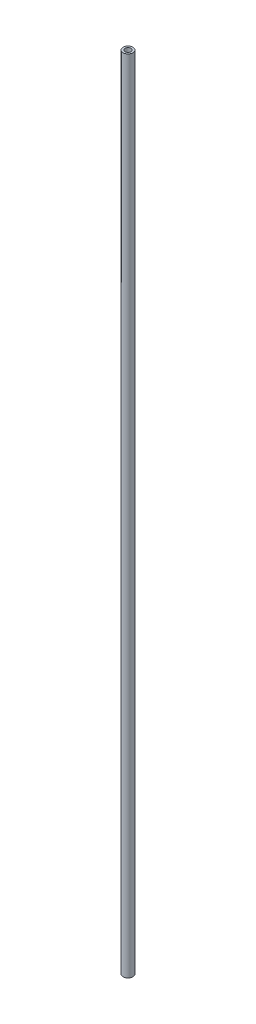
ISO-10303-21;
HEADER;
FILE_DESCRIPTION(('STEP AP214'),'2;1');
FILE_NAME('part.step','',(''),(''),'','','');
FILE_SCHEMA(('AUTOMOTIVE_DESIGN { 1 0 10303 214 1 1 1 1 }'));
ENDSEC;
DATA;
#1=APPLICATION_CONTEXT('core data for automotive mechanical design processes');
#2=APPLICATION_PROTOCOL_DEFINITION('international standard','automotive_design',2000,#1);
#3=PRODUCT_CONTEXT('',#1,'mechanical');
#4=PRODUCT('Part','Part','',(#3));
#5=PRODUCT_RELATED_PRODUCT_CATEGORY('part','',(#4));
#6=PRODUCT_DEFINITION_FORMATION('','',#4);
#7=PRODUCT_DEFINITION_CONTEXT('part definition',#1,'design');
#8=PRODUCT_DEFINITION('design','',#6,#7);
#9=PRODUCT_DEFINITION_SHAPE('','',#8);
#10=(LENGTH_UNIT() NAMED_UNIT(*) SI_UNIT(.MILLI.,.METRE.));
#11=(NAMED_UNIT(*) PLANE_ANGLE_UNIT() SI_UNIT($,.RADIAN.));
#12=(NAMED_UNIT(*) SI_UNIT($,.STERADIAN.) SOLID_ANGLE_UNIT());
#13=UNCERTAINTY_MEASURE_WITH_UNIT(LENGTH_MEASURE(1.E-05),#10,'distance_accuracy_value','');
#14=(GEOMETRIC_REPRESENTATION_CONTEXT(3) GLOBAL_UNCERTAINTY_ASSIGNED_CONTEXT((#13)) GLOBAL_UNIT_ASSIGNED_CONTEXT((#10,
#11,#12)) REPRESENTATION_CONTEXT('',''));
#15=CARTESIAN_POINT('',(0.,0.,0.));
#16=DIRECTION('',(0.,0.,1.));
#17=DIRECTION('',(1.,0.,0.));
#18=AXIS2_PLACEMENT_3D('',#15,#16,#17);
#19=CARTESIAN_POINT('',(0.,205.,0.));
#20=DIRECTION('',(0.,1.,0.));
#21=DIRECTION('',(0.,0.,1.));
#22=AXIS2_PLACEMENT_3D('',#19,#20,#21);
#23=PLANE('',#22);
#24=CARTESIAN_POINT('',(0.,205.,0.));
#25=DIRECTION('',(0.,1.,0.));
#26=DIRECTION('',(0.,0.,1.));
#27=AXIS2_PLACEMENT_3D('',#24,#25,#26);
#28=CIRCLE('',#27,2.5);
#29=CARTESIAN_POINT('',(0.,205.,-2.5));
#30=VERTEX_POINT('',#29);
#31=EDGE_CURVE('E12',#30,#30,#28,.T.);
#32=ORIENTED_EDGE('',*,*,#31,.T.);
#33=EDGE_LOOP('',(#32));
#34=FACE_BOUND('',#33,.T.);
#35=CARTESIAN_POINT('',(0.,205.,0.));
#36=DIRECTION('',(0.,1.,0.));
#37=DIRECTION('',(0.,0.,1.));
#38=AXIS2_PLACEMENT_3D('',#35,#36,#37);
#39=CIRCLE('',#38,1.5);
#40=CARTESIAN_POINT('',(0.,205.,-1.5));
#41=VERTEX_POINT('',#40);
#42=EDGE_CURVE('E54',#41,#41,#39,.T.);
#43=ORIENTED_EDGE('',*,*,#42,.F.);
#44=EDGE_LOOP('',(#43));
#45=FACE_BOUND('',#44,.T.);
#46=ADVANCED_FACE('F43',(#34,#45),#23,.T.);
#47=CARTESIAN_POINT('',(0.,-205.,0.));
#48=DIRECTION('',(0.,1.,0.));
#49=DIRECTION('',(0.,0.,1.));
#50=AXIS2_PLACEMENT_3D('',#47,#48,#49);
#51=PLANE('',#50);
#52=CARTESIAN_POINT('',(0.,-205.,0.));
#53=DIRECTION('',(0.,1.,0.));
#54=DIRECTION('',(0.,0.,1.));
#55=AXIS2_PLACEMENT_3D('',#52,#53,#54);
#56=CIRCLE('',#55,2.5);
#57=CARTESIAN_POINT('',(0.,-205.,-2.5));
#58=VERTEX_POINT('',#57);
#59=EDGE_CURVE('E47',#58,#58,#56,.T.);
#60=ORIENTED_EDGE('',*,*,#59,.F.);
#61=EDGE_LOOP('',(#60));
#62=FACE_BOUND('',#61,.T.);
#63=CARTESIAN_POINT('',(0.,-205.,0.));
#64=DIRECTION('',(0.,1.,0.));
#65=DIRECTION('',(0.,0.,1.));
#66=AXIS2_PLACEMENT_3D('',#63,#64,#65);
#67=CIRCLE('',#66,1.5);
#68=CARTESIAN_POINT('',(0.,-205.,-1.5));
#69=VERTEX_POINT('',#68);
#70=EDGE_CURVE('E56',#69,#69,#67,.T.);
#71=ORIENTED_EDGE('',*,*,#70,.T.);
#72=EDGE_LOOP('',(#71));
#73=FACE_BOUND('',#72,.T.);
#74=ADVANCED_FACE('F66',(#62,#73),#51,.F.);
#75=CARTESIAN_POINT('',(0.,205.,0.));
#76=DIRECTION('',(0.,-1.,0.));
#77=DIRECTION('',(0.,0.,-1.));
#78=AXIS2_PLACEMENT_3D('',#75,#76,#77);
#79=CYLINDRICAL_SURFACE('',#78,2.5);
#80=CARTESIAN_POINT('',(0.,205.,-2.5));
#81=CARTESIAN_POINT('',(0.,200.729166666667,-2.5));
#82=CARTESIAN_POINT('',(0.,196.458333333333,-2.5));
#83=CARTESIAN_POINT('',(0.,187.916666666667,-2.5));
#84=CARTESIAN_POINT('',(0.,183.645833333333,-2.5));
#85=CARTESIAN_POINT('',(0.,175.104166666667,-2.5));
#86=CARTESIAN_POINT('',(0.,170.833333333333,-2.5));
#87=CARTESIAN_POINT('',(0.,162.291666666667,-2.5));
#88=CARTESIAN_POINT('',(0.,158.020833333333,-2.5));
#89=CARTESIAN_POINT('',(0.,149.479166666667,-2.5));
#90=CARTESIAN_POINT('',(0.,145.208333333333,-2.5));
#91=CARTESIAN_POINT('',(0.,136.666666666667,-2.5));
#92=CARTESIAN_POINT('',(0.,132.395833333333,-2.5));
#93=CARTESIAN_POINT('',(0.,123.854166666667,-2.5));
#94=CARTESIAN_POINT('',(0.,119.583333333333,-2.5));
#95=CARTESIAN_POINT('',(0.,111.041666666667,-2.5));
#96=CARTESIAN_POINT('',(0.,106.770833333333,-2.5));
#97=CARTESIAN_POINT('',(0.,98.2291666666666,-2.5));
#98=CARTESIAN_POINT('',(0.,93.9583333333333,-2.5));
#99=CARTESIAN_POINT('',(0.,85.4166666666667,-2.5));
#100=CARTESIAN_POINT('',(0.,81.1458333333333,-2.5));
#101=CARTESIAN_POINT('',(0.,72.6041666666667,-2.5));
#102=CARTESIAN_POINT('',(0.,68.3333333333333,-2.5));
#103=CARTESIAN_POINT('',(0.,59.7916666666667,-2.5));
#104=CARTESIAN_POINT('',(0.,55.5208333333333,-2.5));
#105=CARTESIAN_POINT('',(0.,46.9791666666667,-2.5));
#106=CARTESIAN_POINT('',(0.,42.7083333333333,-2.5));
#107=CARTESIAN_POINT('',(0.,34.1666666666667,-2.5));
#108=CARTESIAN_POINT('',(0.,29.8958333333333,-2.5));
#109=CARTESIAN_POINT('',(0.,21.3541666666667,-2.5));
#110=CARTESIAN_POINT('',(0.,17.0833333333333,-2.5));
#111=CARTESIAN_POINT('',(0.,8.54166666666667,-2.5));
#112=CARTESIAN_POINT('',(0.,4.27083333333333,-2.5));
#113=CARTESIAN_POINT('',(0.,-4.27083333333333,-2.5));
#114=CARTESIAN_POINT('',(0.,-8.54166666666667,-2.5));
#115=CARTESIAN_POINT('',(0.,-17.0833333333333,-2.5));
#116=CARTESIAN_POINT('',(0.,-21.3541666666667,-2.5));
#117=CARTESIAN_POINT('',(0.,-29.8958333333333,-2.5));
#118=CARTESIAN_POINT('',(0.,-34.1666666666667,-2.5));
#119=CARTESIAN_POINT('',(0.,-42.7083333333333,-2.5));
#120=CARTESIAN_POINT('',(0.,-46.9791666666667,-2.5));
#121=CARTESIAN_POINT('',(0.,-55.5208333333333,-2.5));
#122=CARTESIAN_POINT('',(0.,-59.7916666666667,-2.5));
#123=CARTESIAN_POINT('',(0.,-68.3333333333333,-2.5));
#124=CARTESIAN_POINT('',(0.,-72.6041666666667,-2.5));
#125=CARTESIAN_POINT('',(0.,-81.1458333333333,-2.5));
#126=CARTESIAN_POINT('',(0.,-85.4166666666667,-2.5));
#127=CARTESIAN_POINT('',(0.,-93.9583333333333,-2.5));
#128=CARTESIAN_POINT('',(0.,-98.2291666666666,-2.5));
#129=CARTESIAN_POINT('',(0.,-106.770833333333,-2.5));
#130=CARTESIAN_POINT('',(0.,-111.041666666667,-2.5));
#131=CARTESIAN_POINT('',(0.,-119.583333333333,-2.5));
#132=CARTESIAN_POINT('',(0.,-123.854166666667,-2.5));
#133=CARTESIAN_POINT('',(0.,-132.395833333333,-2.5));
#134=CARTESIAN_POINT('',(0.,-136.666666666667,-2.5));
#135=CARTESIAN_POINT('',(0.,-145.208333333333,-2.5));
#136=CARTESIAN_POINT('',(0.,-149.479166666667,-2.5));
#137=CARTESIAN_POINT('',(0.,-158.020833333333,-2.5));
#138=CARTESIAN_POINT('',(0.,-162.291666666667,-2.5));
#139=CARTESIAN_POINT('',(0.,-170.833333333333,-2.5));
#140=CARTESIAN_POINT('',(0.,-175.104166666667,-2.5));
#141=CARTESIAN_POINT('',(0.,-183.645833333333,-2.5));
#142=CARTESIAN_POINT('',(0.,-187.916666666667,-2.5));
#143=CARTESIAN_POINT('',(0.,-196.458333333333,-2.5));
#144=CARTESIAN_POINT('',(0.,-200.729166666667,-2.5));
#145=CARTESIAN_POINT('',(0.,-205.,-2.5));
#146=B_SPLINE_CURVE_WITH_KNOTS('',3,(#80,#81,#82,#83,#84,#85,#86,#87,#88,#89,#90,#91,#92,#93,
#94,#95,#96,#97,#98,#99,#100,#101,#102,#103,#104,#105,#106,#107,#108,#109,#110,#111,#112,#113,
#114,#115,#116,#117,#118,#119,#120,#121,#122,#123,#124,#125,#126,#127,#128,#129,#130,#131,#132,
#133,#134,#135,#136,#137,#138,#139,#140,#141,#142,#143,#144,#145),.UNSPECIFIED.,.F.,.F.,(4,2,2,
2,2,2,2,2,2,2,2,2,2,2,2,2,2,2,2,2,2,2,2,2,2,2,2,2,2,2,2,2,4),(0.,12.8125,25.625,38.4375,51.25,
64.0625,76.875,89.6875,102.5,115.3125,128.125,140.9375,153.75,166.5625,179.375,192.1875,205.,
217.8125,230.625,243.4375,256.25,269.0625,281.875,294.6875,307.5,320.3125,333.125,345.9375,
358.75,371.5625,384.375,397.1875,410.),.UNSPECIFIED.);
#147=EDGE_CURVE('BSEAM45',#30,#58,#146,.T.);
#148=ORIENTED_EDGE('',*,*,#31,.F.);
#149=ORIENTED_EDGE('',*,*,#59,.T.);
#150=ORIENTED_EDGE('',*,*,#147,.T.);
#151=ORIENTED_EDGE('',*,*,#147,.F.);
#152=EDGE_LOOP('',(#148,#150,#149,#151));
#153=FACE_BOUND('',#152,.T.);
#154=ADVANCED_FACE('F45',(#153),#79,.T.);
#155=CARTESIAN_POINT('',(0.,205.,0.));
#156=DIRECTION('',(0.,-1.,0.));
#157=DIRECTION('',(0.,0.,-1.));
#158=AXIS2_PLACEMENT_3D('',#155,#156,#157);
#159=CYLINDRICAL_SURFACE('',#158,1.5);
#160=CARTESIAN_POINT('',(0.,205.,-1.5));
#161=CARTESIAN_POINT('',(0.,200.729166666667,-1.5));
#162=CARTESIAN_POINT('',(0.,196.458333333333,-1.5));
#163=CARTESIAN_POINT('',(0.,187.916666666667,-1.5));
#164=CARTESIAN_POINT('',(0.,183.645833333333,-1.5));
#165=CARTESIAN_POINT('',(0.,175.104166666667,-1.5));
#166=CARTESIAN_POINT('',(0.,170.833333333333,-1.5));
#167=CARTESIAN_POINT('',(0.,162.291666666667,-1.5));
#168=CARTESIAN_POINT('',(0.,158.020833333333,-1.5));
#169=CARTESIAN_POINT('',(0.,149.479166666667,-1.5));
#170=CARTESIAN_POINT('',(0.,145.208333333333,-1.5));
#171=CARTESIAN_POINT('',(0.,136.666666666667,-1.5));
#172=CARTESIAN_POINT('',(0.,132.395833333333,-1.5));
#173=CARTESIAN_POINT('',(0.,123.854166666667,-1.5));
#174=CARTESIAN_POINT('',(0.,119.583333333333,-1.5));
#175=CARTESIAN_POINT('',(0.,111.041666666667,-1.5));
#176=CARTESIAN_POINT('',(0.,106.770833333333,-1.5));
#177=CARTESIAN_POINT('',(0.,98.2291666666666,-1.5));
#178=CARTESIAN_POINT('',(0.,93.9583333333333,-1.5));
#179=CARTESIAN_POINT('',(0.,85.4166666666667,-1.5));
#180=CARTESIAN_POINT('',(0.,81.1458333333333,-1.5));
#181=CARTESIAN_POINT('',(0.,72.6041666666667,-1.5));
#182=CARTESIAN_POINT('',(0.,68.3333333333333,-1.5));
#183=CARTESIAN_POINT('',(0.,59.7916666666667,-1.5));
#184=CARTESIAN_POINT('',(0.,55.5208333333333,-1.5));
#185=CARTESIAN_POINT('',(0.,46.9791666666667,-1.5));
#186=CARTESIAN_POINT('',(0.,42.7083333333333,-1.5));
#187=CARTESIAN_POINT('',(0.,34.1666666666667,-1.5));
#188=CARTESIAN_POINT('',(0.,29.8958333333333,-1.5));
#189=CARTESIAN_POINT('',(0.,21.3541666666667,-1.5));
#190=CARTESIAN_POINT('',(0.,17.0833333333333,-1.5));
#191=CARTESIAN_POINT('',(0.,8.54166666666667,-1.5));
#192=CARTESIAN_POINT('',(0.,4.27083333333333,-1.5));
#193=CARTESIAN_POINT('',(0.,-4.27083333333333,-1.5));
#194=CARTESIAN_POINT('',(0.,-8.54166666666667,-1.5));
#195=CARTESIAN_POINT('',(0.,-17.0833333333333,-1.5));
#196=CARTESIAN_POINT('',(0.,-21.3541666666667,-1.5));
#197=CARTESIAN_POINT('',(0.,-29.8958333333333,-1.5));
#198=CARTESIAN_POINT('',(0.,-34.1666666666667,-1.5));
#199=CARTESIAN_POINT('',(0.,-42.7083333333333,-1.5));
#200=CARTESIAN_POINT('',(0.,-46.9791666666667,-1.5));
#201=CARTESIAN_POINT('',(0.,-55.5208333333333,-1.5));
#202=CARTESIAN_POINT('',(0.,-59.7916666666667,-1.5));
#203=CARTESIAN_POINT('',(0.,-68.3333333333333,-1.5));
#204=CARTESIAN_POINT('',(0.,-72.6041666666667,-1.5));
#205=CARTESIAN_POINT('',(0.,-81.1458333333333,-1.5));
#206=CARTESIAN_POINT('',(0.,-85.4166666666667,-1.5));
#207=CARTESIAN_POINT('',(0.,-93.9583333333333,-1.5));
#208=CARTESIAN_POINT('',(0.,-98.2291666666666,-1.5));
#209=CARTESIAN_POINT('',(0.,-106.770833333333,-1.5));
#210=CARTESIAN_POINT('',(0.,-111.041666666667,-1.5));
#211=CARTESIAN_POINT('',(0.,-119.583333333333,-1.5));
#212=CARTESIAN_POINT('',(0.,-123.854166666667,-1.5));
#213=CARTESIAN_POINT('',(0.,-132.395833333333,-1.5));
#214=CARTESIAN_POINT('',(0.,-136.666666666667,-1.5));
#215=CARTESIAN_POINT('',(0.,-145.208333333333,-1.5));
#216=CARTESIAN_POINT('',(0.,-149.479166666667,-1.5));
#217=CARTESIAN_POINT('',(0.,-158.020833333333,-1.5));
#218=CARTESIAN_POINT('',(0.,-162.291666666667,-1.5));
#219=CARTESIAN_POINT('',(0.,-170.833333333333,-1.5));
#220=CARTESIAN_POINT('',(0.,-175.104166666667,-1.5));
#221=CARTESIAN_POINT('',(0.,-183.645833333333,-1.5));
#222=CARTESIAN_POINT('',(0.,-187.916666666667,-1.5));
#223=CARTESIAN_POINT('',(0.,-196.458333333333,-1.5));
#224=CARTESIAN_POINT('',(0.,-200.729166666667,-1.5));
#225=CARTESIAN_POINT('',(0.,-205.,-1.5));
#226=B_SPLINE_CURVE_WITH_KNOTS('',3,(#160,#161,#162,#163,#164,#165,#166,#167,#168,#169,#170,
#171,#172,#173,#174,#175,#176,#177,#178,#179,#180,#181,#182,#183,#184,#185,#186,#187,#188,#189,
#190,#191,#192,#193,#194,#195,#196,#197,#198,#199,#200,#201,#202,#203,#204,#205,#206,#207,#208,
#209,#210,#211,#212,#213,#214,#215,#216,#217,#218,#219,#220,#221,#222,#223,#224,#225),
.UNSPECIFIED.,.F.,.F.,(4,2,2,2,2,2,2,2,2,2,2,2,2,2,2,2,2,2,2,2,2,2,2,2,2,2,2,2,2,2,2,2,4),(0.,
12.8125,25.625,38.4375,51.25,64.0625,76.875,89.6875,102.5,115.3125,128.125,140.9375,153.75,
166.5625,179.375,192.1875,205.,217.8125,230.625,243.4375,256.25,269.0625,281.875,294.6875,307.5,
320.3125,333.125,345.9375,358.75,371.5625,384.375,397.1875,410.),.UNSPECIFIED.);
#227=EDGE_CURVE('BSEAM62',#41,#69,#226,.T.);
#228=ORIENTED_EDGE('',*,*,#42,.T.);
#229=ORIENTED_EDGE('',*,*,#70,.F.);
#230=ORIENTED_EDGE('',*,*,#227,.T.);
#231=ORIENTED_EDGE('',*,*,#227,.F.);
#232=EDGE_LOOP('',(#228,#230,#229,#231));
#233=FACE_BOUND('',#232,.T.);
#234=ADVANCED_FACE('F62',(#233),#159,.F.);
#235=CLOSED_SHELL('',(#46,#74,#154,#234));
#236=MANIFOLD_SOLID_BREP('B2',#235);
#237=ADVANCED_BREP_SHAPE_REPRESENTATION('',(#18,#236),#14);
#238=SHAPE_DEFINITION_REPRESENTATION(#9,#237);
ENDSEC;
END-ISO-10303-21;
